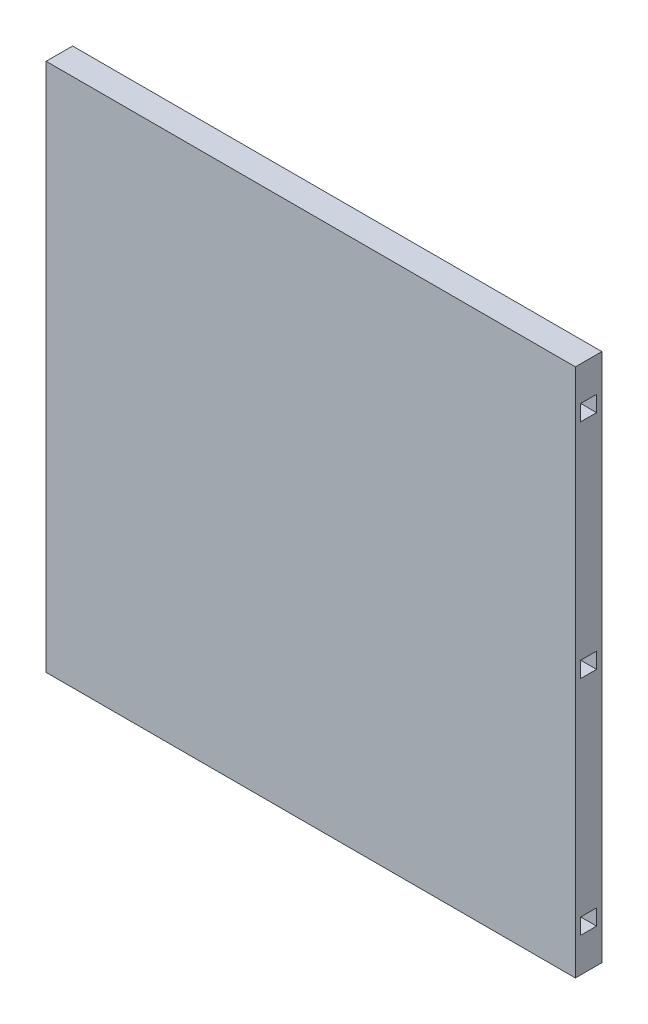
ISO-10303-21;
HEADER;
FILE_DESCRIPTION(('STEP AP214'),'2;1');
FILE_NAME('part.step','',(''),(''),'','','');
FILE_SCHEMA(('AUTOMOTIVE_DESIGN { 1 0 10303 214 1 1 1 1 }'));
ENDSEC;
DATA;
#1=APPLICATION_CONTEXT('core data for automotive mechanical design processes');
#2=APPLICATION_PROTOCOL_DEFINITION('international standard','automotive_design',2000,#1);
#3=PRODUCT_CONTEXT('',#1,'mechanical');
#4=PRODUCT('Part','Part','',(#3));
#5=PRODUCT_RELATED_PRODUCT_CATEGORY('part','',(#4));
#6=PRODUCT_DEFINITION_FORMATION('','',#4);
#7=PRODUCT_DEFINITION_CONTEXT('part definition',#1,'design');
#8=PRODUCT_DEFINITION('design','',#6,#7);
#9=PRODUCT_DEFINITION_SHAPE('','',#8);
#10=(LENGTH_UNIT() NAMED_UNIT(*) SI_UNIT(.MILLI.,.METRE.));
#11=(NAMED_UNIT(*) PLANE_ANGLE_UNIT() SI_UNIT($,.RADIAN.));
#12=(NAMED_UNIT(*) SI_UNIT($,.STERADIAN.) SOLID_ANGLE_UNIT());
#13=UNCERTAINTY_MEASURE_WITH_UNIT(LENGTH_MEASURE(1.E-05),#10,'distance_accuracy_value','');
#14=(GEOMETRIC_REPRESENTATION_CONTEXT(3) GLOBAL_UNCERTAINTY_ASSIGNED_CONTEXT((#13)) GLOBAL_UNIT_ASSIGNED_CONTEXT((#10,
#11,#12)) REPRESENTATION_CONTEXT('',''));
#15=CARTESIAN_POINT('',(0.,0.,0.));
#16=DIRECTION('',(0.,0.,1.));
#17=DIRECTION('',(1.,0.,0.));
#18=AXIS2_PLACEMENT_3D('',#15,#16,#17);
#19=CARTESIAN_POINT('',(-50.,-50.,5.));
#20=DIRECTION('',(0.,1.,0.));
#21=DIRECTION('',(0.,0.,1.));
#22=AXIS2_PLACEMENT_3D('',#19,#20,#21);
#23=PLANE('',#22);
#24=DIRECTION('',(0.,0.,1.));
#25=VECTOR('',#24,1.);
#26=CARTESIAN_POINT('',(-1.5,-50.,0.));
#27=LINE('',#26,#25);
#28=CARTESIAN_POINT('',(-1.5,-50.,1.));
#29=VERTEX_POINT('',#28);
#30=CARTESIAN_POINT('',(-1.5,-50.,4.));
#31=VERTEX_POINT('',#30);
#32=EDGE_CURVE('E63',#29,#31,#27,.T.);
#33=ORIENTED_EDGE('',*,*,#32,.T.);
#34=DIRECTION('',(-1.,0.,0.));
#35=VECTOR('',#34,1.);
#36=CARTESIAN_POINT('',(0.,-50.,4.));
#37=LINE('',#36,#35);
#38=CARTESIAN_POINT('',(1.5,-50.,4.));
#39=VERTEX_POINT('',#38);
#40=EDGE_CURVE('E282',#39,#31,#37,.T.);
#41=ORIENTED_EDGE('',*,*,#40,.F.);
#42=DIRECTION('',(0.,0.,1.));
#43=VECTOR('',#42,1.);
#44=CARTESIAN_POINT('',(1.5,-50.,0.));
#45=LINE('',#44,#43);
#46=CARTESIAN_POINT('',(1.5,-50.,1.));
#47=VERTEX_POINT('',#46);
#48=EDGE_CURVE('E301',#47,#39,#45,.T.);
#49=ORIENTED_EDGE('',*,*,#48,.F.);
#50=DIRECTION('',(-1.,0.,0.));
#51=VECTOR('',#50,1.);
#52=CARTESIAN_POINT('',(0.,-50.,1.));
#53=LINE('',#52,#51);
#54=EDGE_CURVE('E296',#47,#29,#53,.T.);
#55=ORIENTED_EDGE('',*,*,#54,.T.);
#56=EDGE_LOOP('',(#33,#41,#49,#55));
#57=FACE_BOUND('',#56,.T.);
#58=DIRECTION('',(1.,0.,0.));
#59=VECTOR('',#58,1.);
#60=CARTESIAN_POINT('',(-50.,-50.,0.));
#61=LINE('',#60,#59);
#62=CARTESIAN_POINT('',(-50.,-50.,0.));
#63=VERTEX_POINT('',#62);
#64=CARTESIAN_POINT('',(50.,-50.,0.));
#65=VERTEX_POINT('',#64);
#66=EDGE_CURVE('E496',#63,#65,#61,.T.);
#67=ORIENTED_EDGE('',*,*,#66,.T.);
#68=DIRECTION('',(0.,0.,-1.));
#69=VECTOR('',#68,1.);
#70=CARTESIAN_POINT('',(50.,-50.,5.));
#71=LINE('',#70,#69);
#72=CARTESIAN_POINT('',(50.,-50.,5.));
#73=VERTEX_POINT('',#72);
#74=EDGE_CURVE('E505',#73,#65,#71,.T.);
#75=ORIENTED_EDGE('',*,*,#74,.F.);
#76=DIRECTION('',(1.,0.,0.));
#77=VECTOR('',#76,1.);
#78=CARTESIAN_POINT('',(-50.,-50.,5.));
#79=LINE('',#78,#77);
#80=CARTESIAN_POINT('',(-50.,-50.,5.));
#81=VERTEX_POINT('',#80);
#82=EDGE_CURVE('E502',#81,#73,#79,.T.);
#83=ORIENTED_EDGE('',*,*,#82,.F.);
#84=DIRECTION('',(0.,0.,-1.));
#85=VECTOR('',#84,1.);
#86=CARTESIAN_POINT('',(-50.,-50.,5.));
#87=LINE('',#86,#85);
#88=EDGE_CURVE('E520',#81,#63,#87,.T.);
#89=ORIENTED_EDGE('',*,*,#88,.T.);
#90=EDGE_LOOP('',(#67,#75,#83,#89));
#91=FACE_BOUND('',#90,.T.);
#92=DIRECTION('',(1.,0.,0.));
#93=VECTOR('',#92,1.);
#94=CARTESIAN_POINT('',(0.,-50.,4.));
#95=LINE('',#94,#93);
#96=CARTESIAN_POINT('',(46.,-50.,4.));
#97=VERTEX_POINT('',#96);
#98=CARTESIAN_POINT('',(49.,-50.,4.));
#99=VERTEX_POINT('',#98);
#100=EDGE_CURVE('E335',#97,#99,#95,.T.);
#101=ORIENTED_EDGE('',*,*,#100,.T.);
#102=DIRECTION('',(0.,0.,-1.));
#103=VECTOR('',#102,1.);
#104=CARTESIAN_POINT('',(49.,-50.,0.));
#105=LINE('',#104,#103);
#106=CARTESIAN_POINT('',(49.,-50.,1.));
#107=VERTEX_POINT('',#106);
#108=EDGE_CURVE('E323',#99,#107,#105,.T.);
#109=ORIENTED_EDGE('',*,*,#108,.T.);
#110=DIRECTION('',(1.,0.,0.));
#111=VECTOR('',#110,1.);
#112=CARTESIAN_POINT('',(0.,-50.,1.));
#113=LINE('',#112,#111);
#114=CARTESIAN_POINT('',(46.,-50.,1.));
#115=VERTEX_POINT('',#114);
#116=EDGE_CURVE('E343',#115,#107,#113,.T.);
#117=ORIENTED_EDGE('',*,*,#116,.F.);
#118=DIRECTION('',(0.,0.,-1.));
#119=VECTOR('',#118,1.);
#120=CARTESIAN_POINT('',(46.,-50.,0.));
#121=LINE('',#120,#119);
#122=EDGE_CURVE('E339',#97,#115,#121,.T.);
#123=ORIENTED_EDGE('',*,*,#122,.F.);
#124=EDGE_LOOP('',(#101,#109,#117,#123));
#125=FACE_BOUND('',#124,.T.);
#126=DIRECTION('',(-1.,0.,0.));
#127=VECTOR('',#126,1.);
#128=CARTESIAN_POINT('',(0.,-50.,1.));
#129=LINE('',#128,#127);
#130=CARTESIAN_POINT('',(-46.,-50.,1.));
#131=VERTEX_POINT('',#130);
#132=CARTESIAN_POINT('',(-49.,-50.,1.));
#133=VERTEX_POINT('',#132);
#134=EDGE_CURVE('E55',#131,#133,#129,.T.);
#135=ORIENTED_EDGE('',*,*,#134,.T.);
#136=DIRECTION('',(0.,0.,-1.));
#137=VECTOR('',#136,1.);
#138=CARTESIAN_POINT('',(-49.,-50.,0.));
#139=LINE('',#138,#137);
#140=CARTESIAN_POINT('',(-49.,-50.,4.));
#141=VERTEX_POINT('',#140);
#142=EDGE_CURVE('E249',#141,#133,#139,.T.);
#143=ORIENTED_EDGE('',*,*,#142,.F.);
#144=DIRECTION('',(-1.,0.,0.));
#145=VECTOR('',#144,1.);
#146=CARTESIAN_POINT('',(0.,-50.,4.));
#147=LINE('',#146,#145);
#148=CARTESIAN_POINT('',(-46.,-50.,4.));
#149=VERTEX_POINT('',#148);
#150=EDGE_CURVE('E253',#149,#141,#147,.T.);
#151=ORIENTED_EDGE('',*,*,#150,.F.);
#152=DIRECTION('',(0.,0.,-1.));
#153=VECTOR('',#152,1.);
#154=CARTESIAN_POINT('',(-46.,-50.,0.));
#155=LINE('',#154,#153);
#156=EDGE_CURVE('E262',#149,#131,#155,.T.);
#157=ORIENTED_EDGE('',*,*,#156,.T.);
#158=EDGE_LOOP('',(#135,#143,#151,#157));
#159=FACE_BOUND('',#158,.T.);
#160=ADVANCED_FACE('F39',(#57,#91,#125,#159),#23,.F.);
#161=CARTESIAN_POINT('',(50.,50.,5.));
#162=DIRECTION('',(-1.,0.,0.));
#163=DIRECTION('',(0.,-1.,0.));
#164=AXIS2_PLACEMENT_3D('',#161,#162,#163);
#165=PLANE('',#164);
#166=DIRECTION('',(0.,1.,0.));
#167=VECTOR('',#166,1.);
#168=CARTESIAN_POINT('',(50.,0.,1.));
#169=LINE('',#168,#167);
#170=CARTESIAN_POINT('',(50.,40.5092729378531,1.));
#171=VERTEX_POINT('',#170);
#172=CARTESIAN_POINT('',(50.,43.5092729378531,1.));
#173=VERTEX_POINT('',#172);
#174=EDGE_CURVE('E381',#171,#173,#169,.T.);
#175=ORIENTED_EDGE('',*,*,#174,.F.);
#176=DIRECTION('',(0.,0.,-1.));
#177=VECTOR('',#176,1.);
#178=CARTESIAN_POINT('',(50.,40.5092729378531,0.));
#179=LINE('',#178,#177);
#180=CARTESIAN_POINT('',(50.,40.5092729378531,4.));
#181=VERTEX_POINT('',#180);
#182=EDGE_CURVE('E378',#181,#171,#179,.T.);
#183=ORIENTED_EDGE('',*,*,#182,.F.);
#184=DIRECTION('',(0.,1.,0.));
#185=VECTOR('',#184,1.);
#186=CARTESIAN_POINT('',(50.,0.,4.));
#187=LINE('',#186,#185);
#188=CARTESIAN_POINT('',(50.,43.5092729378531,4.));
#189=VERTEX_POINT('',#188);
#190=EDGE_CURVE('E367',#181,#189,#187,.T.);
#191=ORIENTED_EDGE('',*,*,#190,.T.);
#192=DIRECTION('',(0.,0.,-1.));
#193=VECTOR('',#192,1.);
#194=CARTESIAN_POINT('',(50.,43.5092729378531,0.));
#195=LINE('',#194,#193);
#196=EDGE_CURVE('E386',#189,#173,#195,.T.);
#197=ORIENTED_EDGE('',*,*,#196,.T.);
#198=EDGE_LOOP('',(#175,#183,#191,#197));
#199=FACE_BOUND('',#198,.T.);
#200=DIRECTION('',(0.,1.,0.));
#201=VECTOR('',#200,1.);
#202=CARTESIAN_POINT('',(50.,0.,1.));
#203=LINE('',#202,#201);
#204=CARTESIAN_POINT('',(50.,-1.49999999999999,1.));
#205=VERTEX_POINT('',#204);
#206=CARTESIAN_POINT('',(50.,1.50000000000001,1.));
#207=VERTEX_POINT('',#206);
#208=EDGE_CURVE('E425',#205,#207,#203,.T.);
#209=ORIENTED_EDGE('',*,*,#208,.F.);
#210=DIRECTION('',(0.,0.,-1.));
#211=VECTOR('',#210,1.);
#212=CARTESIAN_POINT('',(50.,-1.5,0.));
#213=LINE('',#212,#211);
#214=CARTESIAN_POINT('',(50.,-1.5,4.));
#215=VERTEX_POINT('',#214);
#216=EDGE_CURVE('E422',#215,#205,#213,.T.);
#217=ORIENTED_EDGE('',*,*,#216,.F.);
#218=DIRECTION('',(0.,1.,0.));
#219=VECTOR('',#218,1.);
#220=CARTESIAN_POINT('',(50.,0.,4.));
#221=LINE('',#220,#219);
#222=CARTESIAN_POINT('',(50.,1.50000000000001,4.));
#223=VERTEX_POINT('',#222);
#224=EDGE_CURVE('E411',#215,#223,#221,.T.);
#225=ORIENTED_EDGE('',*,*,#224,.T.);
#226=DIRECTION('',(0.,0.,-1.));
#227=VECTOR('',#226,1.);
#228=CARTESIAN_POINT('',(50.,1.50000000000001,0.));
#229=LINE('',#228,#227);
#230=EDGE_CURVE('E430',#223,#207,#229,.T.);
#231=ORIENTED_EDGE('',*,*,#230,.T.);
#232=EDGE_LOOP('',(#209,#217,#225,#231));
#233=FACE_BOUND('',#232,.T.);
#234=DIRECTION('',(0.,1.,0.));
#235=VECTOR('',#234,1.);
#236=CARTESIAN_POINT('',(50.,50.,0.));
#237=LINE('',#236,#235);
#238=CARTESIAN_POINT('',(50.,50.,0.));
#239=VERTEX_POINT('',#238);
#240=EDGE_CURVE('E396',#65,#239,#237,.T.);
#241=ORIENTED_EDGE('',*,*,#240,.T.);
#242=DIRECTION('',(0.,0.,-1.));
#243=VECTOR('',#242,1.);
#244=CARTESIAN_POINT('',(50.,50.,5.));
#245=LINE('',#244,#243);
#246=CARTESIAN_POINT('',(50.,50.,5.));
#247=VERTEX_POINT('',#246);
#248=EDGE_CURVE('E11',#247,#239,#245,.T.);
#249=ORIENTED_EDGE('',*,*,#248,.F.);
#250=DIRECTION('',(0.,1.,0.));
#251=VECTOR('',#250,1.);
#252=CARTESIAN_POINT('',(50.,50.,5.));
#253=LINE('',#252,#251);
#254=EDGE_CURVE('E491',#73,#247,#253,.T.);
#255=ORIENTED_EDGE('',*,*,#254,.F.);
#256=ORIENTED_EDGE('',*,*,#74,.T.);
#257=EDGE_LOOP('',(#241,#249,#255,#256));
#258=FACE_BOUND('',#257,.T.);
#259=DIRECTION('',(0.,0.,-1.));
#260=VECTOR('',#259,1.);
#261=CARTESIAN_POINT('',(50.,-40.5092729378531,-1.87393031360122E-13));
#262=LINE('',#261,#260);
#263=CARTESIAN_POINT('',(50.,-40.5092729378531,3.99999999999989));
#264=VERTEX_POINT('',#263);
#265=CARTESIAN_POINT('',(50.,-40.5092729378531,0.999999999999888));
#266=VERTEX_POINT('',#265);
#267=EDGE_CURVE('E272',#264,#266,#262,.T.);
#268=ORIENTED_EDGE('',*,*,#267,.T.);
#269=DIRECTION('',(0.,-1.,0.));
#270=VECTOR('',#269,1.);
#271=CARTESIAN_POINT('',(50.,0.,0.999999999999999));
#272=LINE('',#271,#270);
#273=CARTESIAN_POINT('',(50.,-43.5092729378531,0.999999999999879));
#274=VERTEX_POINT('',#273);
#275=EDGE_CURVE('E453',#266,#274,#272,.T.);
#276=ORIENTED_EDGE('',*,*,#275,.T.);
#277=DIRECTION('',(0.,0.,-1.));
#278=VECTOR('',#277,1.);
#279=CARTESIAN_POINT('',(50.,-43.5092729378531,-2.01270819167936E-13));
#280=LINE('',#279,#278);
#281=CARTESIAN_POINT('',(50.,-43.5092729378531,3.99999999999988));
#282=VERTEX_POINT('',#281);
#283=EDGE_CURVE('E472',#282,#274,#280,.T.);
#284=ORIENTED_EDGE('',*,*,#283,.F.);
#285=DIRECTION('',(0.,-1.,0.));
#286=VECTOR('',#285,1.);
#287=CARTESIAN_POINT('',(50.,0.,4.));
#288=LINE('',#287,#286);
#289=EDGE_CURVE('E468',#264,#282,#288,.T.);
#290=ORIENTED_EDGE('',*,*,#289,.F.);
#291=EDGE_LOOP('',(#268,#276,#284,#290));
#292=FACE_BOUND('',#291,.T.);
#293=ADVANCED_FACE('F41',(#199,#233,#258,#292),#165,.F.);
#294=CARTESIAN_POINT('',(-50.,50.,5.));
#295=DIRECTION('',(0.,-1.,0.));
#296=DIRECTION('',(0.,0.,-1.));
#297=AXIS2_PLACEMENT_3D('',#294,#295,#296);
#298=PLANE('',#297);
#299=DIRECTION('',(-1.,0.,0.));
#300=VECTOR('',#299,1.);
#301=CARTESIAN_POINT('',(-50.,50.,0.));
#302=LINE('',#301,#300);
#303=CARTESIAN_POINT('',(-50.,50.,0.));
#304=VERTEX_POINT('',#303);
#305=EDGE_CURVE('E509',#239,#304,#302,.T.);
#306=ORIENTED_EDGE('',*,*,#305,.T.);
#307=DIRECTION('',(0.,0.,-1.));
#308=VECTOR('',#307,1.);
#309=CARTESIAN_POINT('',(-50.,50.,5.));
#310=LINE('',#309,#308);
#311=CARTESIAN_POINT('',(-50.,50.,5.));
#312=VERTEX_POINT('',#311);
#313=EDGE_CURVE('E48',#312,#304,#310,.T.);
#314=ORIENTED_EDGE('',*,*,#313,.F.);
#315=DIRECTION('',(-1.,0.,0.));
#316=VECTOR('',#315,1.);
#317=CARTESIAN_POINT('',(-50.,50.,5.));
#318=LINE('',#317,#316);
#319=EDGE_CURVE('E495',#247,#312,#318,.T.);
#320=ORIENTED_EDGE('',*,*,#319,.F.);
#321=ORIENTED_EDGE('',*,*,#248,.T.);
#322=EDGE_LOOP('',(#306,#314,#320,#321));
#323=FACE_BOUND('',#322,.T.);
#324=ADVANCED_FACE('F546',(#323),#298,.F.);
#325=CARTESIAN_POINT('',(-50.,50.,5.));
#326=DIRECTION('',(1.,0.,0.));
#327=DIRECTION('',(0.,1.,0.));
#328=AXIS2_PLACEMENT_3D('',#325,#326,#327);
#329=PLANE('',#328);
#330=DIRECTION('',(0.,-1.,0.));
#331=VECTOR('',#330,1.);
#332=CARTESIAN_POINT('',(-50.,50.,0.));
#333=LINE('',#332,#331);
#334=EDGE_CURVE('E512',#304,#63,#333,.T.);
#335=ORIENTED_EDGE('',*,*,#334,.T.);
#336=ORIENTED_EDGE('',*,*,#88,.F.);
#337=DIRECTION('',(0.,-1.,0.));
#338=VECTOR('',#337,1.);
#339=CARTESIAN_POINT('',(-50.,50.,5.));
#340=LINE('',#339,#338);
#341=EDGE_CURVE('E499',#312,#81,#340,.T.);
#342=ORIENTED_EDGE('',*,*,#341,.F.);
#343=ORIENTED_EDGE('',*,*,#313,.T.);
#344=EDGE_LOOP('',(#335,#336,#342,#343));
#345=FACE_BOUND('',#344,.T.);
#346=ADVANCED_FACE('F529',(#345),#329,.F.);
#347=CARTESIAN_POINT('',(0.,0.,5.));
#348=DIRECTION('',(0.,0.,1.));
#349=DIRECTION('',(1.,0.,0.));
#350=AXIS2_PLACEMENT_3D('',#347,#348,#349);
#351=PLANE('',#350);
#352=ORIENTED_EDGE('',*,*,#254,.T.);
#353=ORIENTED_EDGE('',*,*,#319,.T.);
#354=ORIENTED_EDGE('',*,*,#341,.T.);
#355=ORIENTED_EDGE('',*,*,#82,.T.);
#356=EDGE_LOOP('',(#352,#353,#354,#355));
#357=FACE_BOUND('',#356,.T.);
#358=ADVANCED_FACE('F545',(#357),#351,.T.);
#359=CARTESIAN_POINT('',(0.,0.,0.));
#360=DIRECTION('',(0.,0.,1.));
#361=DIRECTION('',(1.,0.,0.));
#362=AXIS2_PLACEMENT_3D('',#359,#360,#361);
#363=PLANE('',#362);
#364=ORIENTED_EDGE('',*,*,#240,.F.);
#365=ORIENTED_EDGE('',*,*,#66,.F.);
#366=ORIENTED_EDGE('',*,*,#334,.F.);
#367=ORIENTED_EDGE('',*,*,#305,.F.);
#368=EDGE_LOOP('',(#364,#365,#366,#367));
#369=FACE_BOUND('',#368,.T.);
#370=ADVANCED_FACE('F535',(#369),#363,.F.);
#371=CARTESIAN_POINT('',(45.,-40.5092729378531,-1.87393031360122E-13));
#372=DIRECTION('',(0.,-1.,0.));
#373=DIRECTION('',(0.,0.,-1.));
#374=AXIS2_PLACEMENT_3D('',#371,#372,#373);
#375=PLANE('',#374);
#376=ORIENTED_EDGE('',*,*,#267,.F.);
#377=DIRECTION('',(1.,0.,0.));
#378=VECTOR('',#377,1.);
#379=CARTESIAN_POINT('',(45.,-40.5092729378531,3.99999999999989));
#380=LINE('',#379,#378);
#381=CARTESIAN_POINT('',(45.,-40.5092729378531,3.99999999999989));
#382=VERTEX_POINT('',#381);
#383=EDGE_CURVE('E464',#382,#264,#380,.T.);
#384=ORIENTED_EDGE('',*,*,#383,.F.);
#385=DIRECTION('',(0.,0.,-1.));
#386=VECTOR('',#385,1.);
#387=CARTESIAN_POINT('',(45.,-40.5092729378531,-1.87393031360122E-13));
#388=LINE('',#387,#386);
#389=CARTESIAN_POINT('',(45.,-40.5092729378531,0.999999999999888));
#390=VERTEX_POINT('',#389);
#391=EDGE_CURVE('E448',#382,#390,#388,.T.);
#392=ORIENTED_EDGE('',*,*,#391,.T.);
#393=DIRECTION('',(1.,0.,0.));
#394=VECTOR('',#393,1.);
#395=CARTESIAN_POINT('',(45.,-40.5092729378531,0.999999999999888));
#396=LINE('',#395,#394);
#397=EDGE_CURVE('E426',#390,#266,#396,.T.);
#398=ORIENTED_EDGE('',*,*,#397,.T.);
#399=EDGE_LOOP('',(#376,#384,#392,#398));
#400=FACE_BOUND('',#399,.T.);
#401=ADVANCED_FACE('F562',(#400),#375,.T.);
#402=CARTESIAN_POINT('',(45.,0.,0.999999999999999));
#403=DIRECTION('',(0.,0.,1.));
#404=DIRECTION('',(0.,-1.,0.));
#405=AXIS2_PLACEMENT_3D('',#402,#403,#404);
#406=PLANE('',#405);
#407=ORIENTED_EDGE('',*,*,#275,.F.);
#408=ORIENTED_EDGE('',*,*,#397,.F.);
#409=DIRECTION('',(0.,-1.,0.));
#410=VECTOR('',#409,1.);
#411=CARTESIAN_POINT('',(45.,0.,0.999999999999999));
#412=LINE('',#411,#410);
#413=CARTESIAN_POINT('',(45.,-43.5092729378531,0.999999999999879));
#414=VERTEX_POINT('',#413);
#415=EDGE_CURVE('E461',#390,#414,#412,.T.);
#416=ORIENTED_EDGE('',*,*,#415,.T.);
#417=DIRECTION('',(1.,0.,0.));
#418=VECTOR('',#417,1.);
#419=CARTESIAN_POINT('',(45.,-43.5092729378531,0.999999999999879));
#420=LINE('',#419,#418);
#421=EDGE_CURVE('E482',#414,#274,#420,.T.);
#422=ORIENTED_EDGE('',*,*,#421,.T.);
#423=EDGE_LOOP('',(#407,#408,#416,#422));
#424=FACE_BOUND('',#423,.T.);
#425=ADVANCED_FACE('F567',(#424),#406,.T.);
#426=CARTESIAN_POINT('',(45.,-43.5092729378531,-2.01270819167936E-13));
#427=DIRECTION('',(0.,-1.,0.));
#428=DIRECTION('',(0.,0.,-1.));
#429=AXIS2_PLACEMENT_3D('',#426,#427,#428);
#430=PLANE('',#429);
#431=ORIENTED_EDGE('',*,*,#283,.T.);
#432=ORIENTED_EDGE('',*,*,#421,.F.);
#433=DIRECTION('',(0.,0.,-1.));
#434=VECTOR('',#433,1.);
#435=CARTESIAN_POINT('',(45.,-43.5092729378531,-2.01270819167936E-13));
#436=LINE('',#435,#434);
#437=CARTESIAN_POINT('',(45.,-43.5092729378531,3.99999999999988));
#438=VERTEX_POINT('',#437);
#439=EDGE_CURVE('E457',#438,#414,#436,.T.);
#440=ORIENTED_EDGE('',*,*,#439,.F.);
#441=DIRECTION('',(1.,0.,0.));
#442=VECTOR('',#441,1.);
#443=CARTESIAN_POINT('',(45.,-43.5092729378531,3.99999999999988));
#444=LINE('',#443,#442);
#445=EDGE_CURVE('E485',#438,#282,#444,.T.);
#446=ORIENTED_EDGE('',*,*,#445,.T.);
#447=EDGE_LOOP('',(#431,#432,#440,#446));
#448=FACE_BOUND('',#447,.T.);
#449=ADVANCED_FACE('F573',(#448),#430,.F.);
#450=CARTESIAN_POINT('',(45.,0.,4.));
#451=DIRECTION('',(0.,0.,1.));
#452=DIRECTION('',(0.,-1.,0.));
#453=AXIS2_PLACEMENT_3D('',#450,#451,#452);
#454=PLANE('',#453);
#455=ORIENTED_EDGE('',*,*,#289,.T.);
#456=ORIENTED_EDGE('',*,*,#445,.F.);
#457=DIRECTION('',(0.,-1.,0.));
#458=VECTOR('',#457,1.);
#459=CARTESIAN_POINT('',(45.,0.,4.));
#460=LINE('',#459,#458);
#461=EDGE_CURVE('E452',#382,#438,#460,.T.);
#462=ORIENTED_EDGE('',*,*,#461,.F.);
#463=ORIENTED_EDGE('',*,*,#383,.T.);
#464=EDGE_LOOP('',(#455,#456,#462,#463));
#465=FACE_BOUND('',#464,.T.);
#466=ADVANCED_FACE('F569',(#465),#454,.F.);
#467=CARTESIAN_POINT('',(45.,0.,0.));
#468=DIRECTION('',(1.,0.,0.));
#469=DIRECTION('',(0.,1.,0.));
#470=AXIS2_PLACEMENT_3D('',#467,#468,#469);
#471=PLANE('',#470);
#472=ORIENTED_EDGE('',*,*,#391,.F.);
#473=ORIENTED_EDGE('',*,*,#461,.T.);
#474=ORIENTED_EDGE('',*,*,#439,.T.);
#475=ORIENTED_EDGE('',*,*,#415,.F.);
#476=EDGE_LOOP('',(#472,#473,#474,#475));
#477=FACE_BOUND('',#476,.T.);
#478=ADVANCED_FACE('F572',(#477),#471,.T.);
#479=CARTESIAN_POINT('',(45.,-1.5,0.));
#480=DIRECTION('',(0.,-1.,0.));
#481=DIRECTION('',(1.,0.,0.));
#482=AXIS2_PLACEMENT_3D('',#479,#480,#481);
#483=PLANE('',#482);
#484=ORIENTED_EDGE('',*,*,#216,.T.);
#485=DIRECTION('',(1.,0.,0.));
#486=VECTOR('',#485,1.);
#487=CARTESIAN_POINT('',(45.,-1.5,1.));
#488=LINE('',#487,#486);
#489=CARTESIAN_POINT('',(45.,-1.5,1.));
#490=VERTEX_POINT('',#489);
#491=EDGE_CURVE('E421',#490,#205,#488,.T.);
#492=ORIENTED_EDGE('',*,*,#491,.F.);
#493=DIRECTION('',(0.,0.,-1.));
#494=VECTOR('',#493,1.);
#495=CARTESIAN_POINT('',(45.,-1.5,0.));
#496=LINE('',#495,#494);
#497=CARTESIAN_POINT('',(45.,-1.5,4.));
#498=VERTEX_POINT('',#497);
#499=EDGE_CURVE('E406',#498,#490,#496,.T.);
#500=ORIENTED_EDGE('',*,*,#499,.F.);
#501=DIRECTION('',(1.,0.,0.));
#502=VECTOR('',#501,1.);
#503=CARTESIAN_POINT('',(45.,-1.5,4.));
#504=LINE('',#503,#502);
#505=EDGE_CURVE('E382',#498,#215,#504,.T.);
#506=ORIENTED_EDGE('',*,*,#505,.T.);
#507=EDGE_LOOP('',(#484,#492,#500,#506));
#508=FACE_BOUND('',#507,.T.);
#509=ADVANCED_FACE('F583',(#508),#483,.F.);
#510=CARTESIAN_POINT('',(45.,0.,4.));
#511=DIRECTION('',(0.,0.,-1.));
#512=DIRECTION('',(-1.,0.,0.));
#513=AXIS2_PLACEMENT_3D('',#510,#511,#512);
#514=PLANE('',#513);
#515=ORIENTED_EDGE('',*,*,#224,.F.);
#516=ORIENTED_EDGE('',*,*,#505,.F.);
#517=DIRECTION('',(0.,1.,0.));
#518=VECTOR('',#517,1.);
#519=CARTESIAN_POINT('',(45.,0.,4.));
#520=LINE('',#519,#518);
#521=CARTESIAN_POINT('',(45.,1.50000000000001,4.));
#522=VERTEX_POINT('',#521);
#523=EDGE_CURVE('E418',#498,#522,#520,.T.);
#524=ORIENTED_EDGE('',*,*,#523,.T.);
#525=DIRECTION('',(1.,0.,0.));
#526=VECTOR('',#525,1.);
#527=CARTESIAN_POINT('',(45.,1.50000000000001,4.));
#528=LINE('',#527,#526);
#529=EDGE_CURVE('E439',#522,#223,#528,.T.);
#530=ORIENTED_EDGE('',*,*,#529,.T.);
#531=EDGE_LOOP('',(#515,#516,#524,#530));
#532=FACE_BOUND('',#531,.T.);
#533=ADVANCED_FACE('F587',(#532),#514,.T.);
#534=CARTESIAN_POINT('',(45.,1.50000000000001,0.));
#535=DIRECTION('',(0.,-1.,0.));
#536=DIRECTION('',(1.,0.,0.));
#537=AXIS2_PLACEMENT_3D('',#534,#535,#536);
#538=PLANE('',#537);
#539=ORIENTED_EDGE('',*,*,#230,.F.);
#540=ORIENTED_EDGE('',*,*,#529,.F.);
#541=DIRECTION('',(0.,0.,-1.));
#542=VECTOR('',#541,1.);
#543=CARTESIAN_POINT('',(45.,1.50000000000001,0.));
#544=LINE('',#543,#542);
#545=CARTESIAN_POINT('',(45.,1.50000000000001,1.));
#546=VERTEX_POINT('',#545);
#547=EDGE_CURVE('E415',#522,#546,#544,.T.);
#548=ORIENTED_EDGE('',*,*,#547,.T.);
#549=DIRECTION('',(1.,0.,0.));
#550=VECTOR('',#549,1.);
#551=CARTESIAN_POINT('',(45.,1.50000000000001,1.));
#552=LINE('',#551,#550);
#553=EDGE_CURVE('E442',#546,#207,#552,.T.);
#554=ORIENTED_EDGE('',*,*,#553,.T.);
#555=EDGE_LOOP('',(#539,#540,#548,#554));
#556=FACE_BOUND('',#555,.T.);
#557=ADVANCED_FACE('F593',(#556),#538,.T.);
#558=CARTESIAN_POINT('',(45.,0.,1.));
#559=DIRECTION('',(0.,0.,-1.));
#560=DIRECTION('',(-1.,0.,0.));
#561=AXIS2_PLACEMENT_3D('',#558,#559,#560);
#562=PLANE('',#561);
#563=ORIENTED_EDGE('',*,*,#208,.T.);
#564=ORIENTED_EDGE('',*,*,#553,.F.);
#565=DIRECTION('',(0.,1.,0.));
#566=VECTOR('',#565,1.);
#567=CARTESIAN_POINT('',(45.,0.,1.));
#568=LINE('',#567,#566);
#569=EDGE_CURVE('E410',#490,#546,#568,.T.);
#570=ORIENTED_EDGE('',*,*,#569,.F.);
#571=ORIENTED_EDGE('',*,*,#491,.T.);
#572=EDGE_LOOP('',(#563,#564,#570,#571));
#573=FACE_BOUND('',#572,.T.);
#574=ADVANCED_FACE('F589',(#573),#562,.F.);
#575=CARTESIAN_POINT('',(45.,0.,0.));
#576=DIRECTION('',(1.,0.,0.));
#577=DIRECTION('',(0.,1.,0.));
#578=AXIS2_PLACEMENT_3D('',#575,#576,#577);
#579=PLANE('',#578);
#580=ORIENTED_EDGE('',*,*,#499,.T.);
#581=ORIENTED_EDGE('',*,*,#569,.T.);
#582=ORIENTED_EDGE('',*,*,#547,.F.);
#583=ORIENTED_EDGE('',*,*,#523,.F.);
#584=EDGE_LOOP('',(#580,#581,#582,#583));
#585=FACE_BOUND('',#584,.T.);
#586=ADVANCED_FACE('F592',(#585),#579,.T.);
#587=CARTESIAN_POINT('',(45.,40.5092729378531,0.));
#588=DIRECTION('',(0.,-1.,0.));
#589=DIRECTION('',(1.,0.,0.));
#590=AXIS2_PLACEMENT_3D('',#587,#588,#589);
#591=PLANE('',#590);
#592=ORIENTED_EDGE('',*,*,#182,.T.);
#593=DIRECTION('',(1.,0.,0.));
#594=VECTOR('',#593,1.);
#595=CARTESIAN_POINT('',(45.,40.5092729378531,1.));
#596=LINE('',#595,#594);
#597=CARTESIAN_POINT('',(45.,40.5092729378531,1.));
#598=VERTEX_POINT('',#597);
#599=EDGE_CURVE('E377',#598,#171,#596,.T.);
#600=ORIENTED_EDGE('',*,*,#599,.F.);
#601=DIRECTION('',(0.,0.,-1.));
#602=VECTOR('',#601,1.);
#603=CARTESIAN_POINT('',(45.,40.5092729378531,0.));
#604=LINE('',#603,#602);
#605=CARTESIAN_POINT('',(45.,40.5092729378531,4.));
#606=VERTEX_POINT('',#605);
#607=EDGE_CURVE('E362',#606,#598,#604,.T.);
#608=ORIENTED_EDGE('',*,*,#607,.F.);
#609=DIRECTION('',(1.,0.,0.));
#610=VECTOR('',#609,1.);
#611=CARTESIAN_POINT('',(45.,40.5092729378531,4.));
#612=LINE('',#611,#610);
#613=EDGE_CURVE('E393',#606,#181,#612,.T.);
#614=ORIENTED_EDGE('',*,*,#613,.T.);
#615=EDGE_LOOP('',(#592,#600,#608,#614));
#616=FACE_BOUND('',#615,.T.);
#617=ADVANCED_FACE('F603',(#616),#591,.F.);
#618=CARTESIAN_POINT('',(45.,0.,4.));
#619=DIRECTION('',(0.,0.,-1.));
#620=DIRECTION('',(-1.,0.,0.));
#621=AXIS2_PLACEMENT_3D('',#618,#619,#620);
#622=PLANE('',#621);
#623=ORIENTED_EDGE('',*,*,#190,.F.);
#624=ORIENTED_EDGE('',*,*,#613,.F.);
#625=DIRECTION('',(0.,1.,0.));
#626=VECTOR('',#625,1.);
#627=CARTESIAN_POINT('',(45.,0.,4.));
#628=LINE('',#627,#626);
#629=CARTESIAN_POINT('',(45.,43.5092729378531,4.));
#630=VERTEX_POINT('',#629);
#631=EDGE_CURVE('E374',#606,#630,#628,.T.);
#632=ORIENTED_EDGE('',*,*,#631,.T.);
#633=DIRECTION('',(1.,0.,0.));
#634=VECTOR('',#633,1.);
#635=CARTESIAN_POINT('',(45.,43.5092729378531,4.));
#636=LINE('',#635,#634);
#637=EDGE_CURVE('E397',#630,#189,#636,.T.);
#638=ORIENTED_EDGE('',*,*,#637,.T.);
#639=EDGE_LOOP('',(#623,#624,#632,#638));
#640=FACE_BOUND('',#639,.T.);
#641=ADVANCED_FACE('F607',(#640),#622,.T.);
#642=CARTESIAN_POINT('',(45.,43.5092729378531,0.));
#643=DIRECTION('',(0.,-1.,0.));
#644=DIRECTION('',(1.,0.,0.));
#645=AXIS2_PLACEMENT_3D('',#642,#643,#644);
#646=PLANE('',#645);
#647=ORIENTED_EDGE('',*,*,#196,.F.);
#648=ORIENTED_EDGE('',*,*,#637,.F.);
#649=DIRECTION('',(0.,0.,-1.));
#650=VECTOR('',#649,1.);
#651=CARTESIAN_POINT('',(45.,43.5092729378531,0.));
#652=LINE('',#651,#650);
#653=CARTESIAN_POINT('',(45.,43.5092729378531,1.));
#654=VERTEX_POINT('',#653);
#655=EDGE_CURVE('E371',#630,#654,#652,.T.);
#656=ORIENTED_EDGE('',*,*,#655,.T.);
#657=DIRECTION('',(1.,0.,0.));
#658=VECTOR('',#657,1.);
#659=CARTESIAN_POINT('',(45.,43.5092729378531,1.));
#660=LINE('',#659,#658);
#661=EDGE_CURVE('E400',#654,#173,#660,.T.);
#662=ORIENTED_EDGE('',*,*,#661,.T.);
#663=EDGE_LOOP('',(#647,#648,#656,#662));
#664=FACE_BOUND('',#663,.T.);
#665=ADVANCED_FACE('F613',(#664),#646,.T.);
#666=CARTESIAN_POINT('',(45.,0.,1.));
#667=DIRECTION('',(0.,0.,-1.));
#668=DIRECTION('',(-1.,0.,0.));
#669=AXIS2_PLACEMENT_3D('',#666,#667,#668);
#670=PLANE('',#669);
#671=ORIENTED_EDGE('',*,*,#174,.T.);
#672=ORIENTED_EDGE('',*,*,#661,.F.);
#673=DIRECTION('',(0.,1.,0.));
#674=VECTOR('',#673,1.);
#675=CARTESIAN_POINT('',(45.,0.,1.));
#676=LINE('',#675,#674);
#677=EDGE_CURVE('E366',#598,#654,#676,.T.);
#678=ORIENTED_EDGE('',*,*,#677,.F.);
#679=ORIENTED_EDGE('',*,*,#599,.T.);
#680=EDGE_LOOP('',(#671,#672,#678,#679));
#681=FACE_BOUND('',#680,.T.);
#682=ADVANCED_FACE('F609',(#681),#670,.F.);
#683=CARTESIAN_POINT('',(45.,0.,0.));
#684=DIRECTION('',(1.,0.,0.));
#685=DIRECTION('',(0.,1.,0.));
#686=AXIS2_PLACEMENT_3D('',#683,#684,#685);
#687=PLANE('',#686);
#688=ORIENTED_EDGE('',*,*,#607,.T.);
#689=ORIENTED_EDGE('',*,*,#677,.T.);
#690=ORIENTED_EDGE('',*,*,#655,.F.);
#691=ORIENTED_EDGE('',*,*,#631,.F.);
#692=EDGE_LOOP('',(#688,#689,#690,#691));
#693=FACE_BOUND('',#692,.T.);
#694=ADVANCED_FACE('F612',(#693),#687,.T.);
#695=CARTESIAN_POINT('',(0.,-45.,4.));
#696=DIRECTION('',(0.,0.,-1.));
#697=DIRECTION('',(-1.,0.,0.));
#698=AXIS2_PLACEMENT_3D('',#695,#696,#697);
#699=PLANE('',#698);
#700=ORIENTED_EDGE('',*,*,#100,.F.);
#701=DIRECTION('',(0.,-1.,0.));
#702=VECTOR('',#701,1.);
#703=CARTESIAN_POINT('',(46.,-45.,4.));
#704=LINE('',#703,#702);
#705=CARTESIAN_POINT('',(46.,-45.,4.));
#706=VERTEX_POINT('',#705);
#707=EDGE_CURVE('E334',#706,#97,#704,.T.);
#708=ORIENTED_EDGE('',*,*,#707,.F.);
#709=DIRECTION('',(1.,0.,0.));
#710=VECTOR('',#709,1.);
#711=CARTESIAN_POINT('',(0.,-45.,4.));
#712=LINE('',#711,#710);
#713=CARTESIAN_POINT('',(49.,-45.,4.));
#714=VERTEX_POINT('',#713);
#715=EDGE_CURVE('E318',#706,#714,#712,.T.);
#716=ORIENTED_EDGE('',*,*,#715,.T.);
#717=DIRECTION('',(0.,-1.,0.));
#718=VECTOR('',#717,1.);
#719=CARTESIAN_POINT('',(49.,-45.,4.));
#720=LINE('',#719,#718);
#721=EDGE_CURVE('E297',#714,#99,#720,.T.);
#722=ORIENTED_EDGE('',*,*,#721,.T.);
#723=EDGE_LOOP('',(#700,#708,#716,#722));
#724=FACE_BOUND('',#723,.T.);
#725=ADVANCED_FACE('F623',(#724),#699,.T.);
#726=CARTESIAN_POINT('',(49.,-45.,0.));
#727=DIRECTION('',(-1.,0.,0.));
#728=DIRECTION('',(0.,0.,1.));
#729=AXIS2_PLACEMENT_3D('',#726,#727,#728);
#730=PLANE('',#729);
#731=ORIENTED_EDGE('',*,*,#108,.F.);
#732=ORIENTED_EDGE('',*,*,#721,.F.);
#733=DIRECTION('',(0.,0.,-1.));
#734=VECTOR('',#733,1.);
#735=CARTESIAN_POINT('',(49.,-45.,0.));
#736=LINE('',#735,#734);
#737=CARTESIAN_POINT('',(49.,-45.,1.));
#738=VERTEX_POINT('',#737);
#739=EDGE_CURVE('E331',#714,#738,#736,.T.);
#740=ORIENTED_EDGE('',*,*,#739,.T.);
#741=DIRECTION('',(0.,-1.,0.));
#742=VECTOR('',#741,1.);
#743=CARTESIAN_POINT('',(49.,-45.,1.));
#744=LINE('',#743,#742);
#745=EDGE_CURVE('E353',#738,#107,#744,.T.);
#746=ORIENTED_EDGE('',*,*,#745,.T.);
#747=EDGE_LOOP('',(#731,#732,#740,#746));
#748=FACE_BOUND('',#747,.T.);
#749=ADVANCED_FACE('F627',(#748),#730,.T.);
#750=CARTESIAN_POINT('',(0.,-45.,1.));
#751=DIRECTION('',(0.,0.,-1.));
#752=DIRECTION('',(-1.,0.,0.));
#753=AXIS2_PLACEMENT_3D('',#750,#751,#752);
#754=PLANE('',#753);
#755=ORIENTED_EDGE('',*,*,#116,.T.);
#756=ORIENTED_EDGE('',*,*,#745,.F.);
#757=DIRECTION('',(1.,0.,0.));
#758=VECTOR('',#757,1.);
#759=CARTESIAN_POINT('',(0.,-45.,1.));
#760=LINE('',#759,#758);
#761=CARTESIAN_POINT('',(46.,-45.,1.));
#762=VERTEX_POINT('',#761);
#763=EDGE_CURVE('E327',#762,#738,#760,.T.);
#764=ORIENTED_EDGE('',*,*,#763,.F.);
#765=DIRECTION('',(0.,-1.,0.));
#766=VECTOR('',#765,1.);
#767=CARTESIAN_POINT('',(46.,-45.,1.));
#768=LINE('',#767,#766);
#769=EDGE_CURVE('E356',#762,#115,#768,.T.);
#770=ORIENTED_EDGE('',*,*,#769,.T.);
#771=EDGE_LOOP('',(#755,#756,#764,#770));
#772=FACE_BOUND('',#771,.T.);
#773=ADVANCED_FACE('F633',(#772),#754,.F.);
#774=CARTESIAN_POINT('',(46.,-45.,0.));
#775=DIRECTION('',(-1.,0.,0.));
#776=DIRECTION('',(0.,0.,1.));
#777=AXIS2_PLACEMENT_3D('',#774,#775,#776);
#778=PLANE('',#777);
#779=ORIENTED_EDGE('',*,*,#122,.T.);
#780=ORIENTED_EDGE('',*,*,#769,.F.);
#781=DIRECTION('',(0.,0.,-1.));
#782=VECTOR('',#781,1.);
#783=CARTESIAN_POINT('',(46.,-45.,0.));
#784=LINE('',#783,#782);
#785=EDGE_CURVE('E322',#706,#762,#784,.T.);
#786=ORIENTED_EDGE('',*,*,#785,.F.);
#787=ORIENTED_EDGE('',*,*,#707,.T.);
#788=EDGE_LOOP('',(#779,#780,#786,#787));
#789=FACE_BOUND('',#788,.T.);
#790=ADVANCED_FACE('F629',(#789),#778,.F.);
#791=CARTESIAN_POINT('',(0.,-45.,0.));
#792=DIRECTION('',(0.,-1.,0.));
#793=DIRECTION('',(0.,0.,-1.));
#794=AXIS2_PLACEMENT_3D('',#791,#792,#793);
#795=PLANE('',#794);
#796=ORIENTED_EDGE('',*,*,#715,.F.);
#797=ORIENTED_EDGE('',*,*,#785,.T.);
#798=ORIENTED_EDGE('',*,*,#763,.T.);
#799=ORIENTED_EDGE('',*,*,#739,.F.);
#800=EDGE_LOOP('',(#796,#797,#798,#799));
#801=FACE_BOUND('',#800,.T.);
#802=ADVANCED_FACE('F632',(#801),#795,.T.);
#803=CARTESIAN_POINT('',(-1.5,-45.,0.));
#804=DIRECTION('',(1.,0.,0.));
#805=DIRECTION('',(0.,0.,-1.));
#806=AXIS2_PLACEMENT_3D('',#803,#804,#805);
#807=PLANE('',#806);
#808=ORIENTED_EDGE('',*,*,#32,.F.);
#809=DIRECTION('',(0.,-1.,0.));
#810=VECTOR('',#809,1.);
#811=CARTESIAN_POINT('',(-1.5,-45.,1.));
#812=LINE('',#811,#810);
#813=CARTESIAN_POINT('',(-1.5,-45.,1.));
#814=VERTEX_POINT('',#813);
#815=EDGE_CURVE('E293',#814,#29,#812,.T.);
#816=ORIENTED_EDGE('',*,*,#815,.F.);
#817=DIRECTION('',(0.,0.,1.));
#818=VECTOR('',#817,1.);
#819=CARTESIAN_POINT('',(-1.5,-45.,0.));
#820=LINE('',#819,#818);
#821=CARTESIAN_POINT('',(-1.5,-45.,4.));
#822=VERTEX_POINT('',#821);
#823=EDGE_CURVE('E278',#814,#822,#820,.T.);
#824=ORIENTED_EDGE('',*,*,#823,.T.);
#825=DIRECTION('',(0.,-1.,0.));
#826=VECTOR('',#825,1.);
#827=CARTESIAN_POINT('',(-1.5,-45.,4.));
#828=LINE('',#827,#826);
#829=EDGE_CURVE('E263',#822,#31,#828,.T.);
#830=ORIENTED_EDGE('',*,*,#829,.T.);
#831=EDGE_LOOP('',(#808,#816,#824,#830));
#832=FACE_BOUND('',#831,.T.);
#833=ADVANCED_FACE('F643',(#832),#807,.T.);
#834=CARTESIAN_POINT('',(0.,-45.,4.));
#835=DIRECTION('',(0.,0.,1.));
#836=DIRECTION('',(1.,0.,0.));
#837=AXIS2_PLACEMENT_3D('',#834,#835,#836);
#838=PLANE('',#837);
#839=ORIENTED_EDGE('',*,*,#40,.T.);
#840=ORIENTED_EDGE('',*,*,#829,.F.);
#841=DIRECTION('',(-1.,0.,0.));
#842=VECTOR('',#841,1.);
#843=CARTESIAN_POINT('',(0.,-45.,4.));
#844=LINE('',#843,#842);
#845=CARTESIAN_POINT('',(1.5,-45.,4.));
#846=VERTEX_POINT('',#845);
#847=EDGE_CURVE('E289',#846,#822,#844,.T.);
#848=ORIENTED_EDGE('',*,*,#847,.F.);
#849=DIRECTION('',(0.,-1.,0.));
#850=VECTOR('',#849,1.);
#851=CARTESIAN_POINT('',(1.5,-45.,4.));
#852=LINE('',#851,#850);
#853=EDGE_CURVE('E310',#846,#39,#852,.T.);
#854=ORIENTED_EDGE('',*,*,#853,.T.);
#855=EDGE_LOOP('',(#839,#840,#848,#854));
#856=FACE_BOUND('',#855,.T.);
#857=ADVANCED_FACE('F647',(#856),#838,.F.);
#858=CARTESIAN_POINT('',(1.5,-45.,0.));
#859=DIRECTION('',(1.,0.,0.));
#860=DIRECTION('',(0.,0.,-1.));
#861=AXIS2_PLACEMENT_3D('',#858,#859,#860);
#862=PLANE('',#861);
#863=ORIENTED_EDGE('',*,*,#48,.T.);
#864=ORIENTED_EDGE('',*,*,#853,.F.);
#865=DIRECTION('',(0.,0.,1.));
#866=VECTOR('',#865,1.);
#867=CARTESIAN_POINT('',(1.5,-45.,0.));
#868=LINE('',#867,#866);
#869=CARTESIAN_POINT('',(1.5,-45.,1.));
#870=VERTEX_POINT('',#869);
#871=EDGE_CURVE('E285',#870,#846,#868,.T.);
#872=ORIENTED_EDGE('',*,*,#871,.F.);
#873=DIRECTION('',(0.,-1.,0.));
#874=VECTOR('',#873,1.);
#875=CARTESIAN_POINT('',(1.5,-45.,1.));
#876=LINE('',#875,#874);
#877=EDGE_CURVE('E313',#870,#47,#876,.T.);
#878=ORIENTED_EDGE('',*,*,#877,.T.);
#879=EDGE_LOOP('',(#863,#864,#872,#878));
#880=FACE_BOUND('',#879,.T.);
#881=ADVANCED_FACE('F652',(#880),#862,.F.);
#882=CARTESIAN_POINT('',(0.,-45.,1.));
#883=DIRECTION('',(0.,0.,1.));
#884=DIRECTION('',(1.,0.,0.));
#885=AXIS2_PLACEMENT_3D('',#882,#883,#884);
#886=PLANE('',#885);
#887=ORIENTED_EDGE('',*,*,#54,.F.);
#888=ORIENTED_EDGE('',*,*,#877,.F.);
#889=DIRECTION('',(-1.,0.,0.));
#890=VECTOR('',#889,1.);
#891=CARTESIAN_POINT('',(0.,-45.,1.));
#892=LINE('',#891,#890);
#893=EDGE_CURVE('E281',#870,#814,#892,.T.);
#894=ORIENTED_EDGE('',*,*,#893,.T.);
#895=ORIENTED_EDGE('',*,*,#815,.T.);
#896=EDGE_LOOP('',(#887,#888,#894,#895));
#897=FACE_BOUND('',#896,.T.);
#898=ADVANCED_FACE('F648',(#897),#886,.T.);
#899=CARTESIAN_POINT('',(0.,-45.,0.));
#900=DIRECTION('',(0.,-1.,0.));
#901=DIRECTION('',(0.,0.,-1.));
#902=AXIS2_PLACEMENT_3D('',#899,#900,#901);
#903=PLANE('',#902);
#904=ORIENTED_EDGE('',*,*,#823,.F.);
#905=ORIENTED_EDGE('',*,*,#893,.F.);
#906=ORIENTED_EDGE('',*,*,#871,.T.);
#907=ORIENTED_EDGE('',*,*,#847,.T.);
#908=EDGE_LOOP('',(#904,#905,#906,#907));
#909=FACE_BOUND('',#908,.T.);
#910=ADVANCED_FACE('F651',(#909),#903,.T.);
#911=CARTESIAN_POINT('',(0.,-45.,1.));
#912=DIRECTION('',(0.,0.,1.));
#913=DIRECTION('',(1.,0.,0.));
#914=AXIS2_PLACEMENT_3D('',#911,#912,#913);
#915=PLANE('',#914);
#916=ORIENTED_EDGE('',*,*,#134,.F.);
#917=DIRECTION('',(0.,-1.,0.));
#918=VECTOR('',#917,1.);
#919=CARTESIAN_POINT('',(-46.,-45.,1.));
#920=LINE('',#919,#918);
#921=CARTESIAN_POINT('',(-46.,-45.,1.));
#922=VERTEX_POINT('',#921);
#923=EDGE_CURVE('E229',#922,#131,#920,.T.);
#924=ORIENTED_EDGE('',*,*,#923,.F.);
#925=DIRECTION('',(-1.,0.,0.));
#926=VECTOR('',#925,1.);
#927=CARTESIAN_POINT('',(0.,-45.,1.));
#928=LINE('',#927,#926);
#929=CARTESIAN_POINT('',(-49.,-45.,1.));
#930=VERTEX_POINT('',#929);
#931=EDGE_CURVE('E238',#922,#930,#928,.T.);
#932=ORIENTED_EDGE('',*,*,#931,.T.);
#933=DIRECTION('',(0.,-1.,0.));
#934=VECTOR('',#933,1.);
#935=CARTESIAN_POINT('',(-49.,-45.,1.));
#936=LINE('',#935,#934);
#937=EDGE_CURVE('E269',#930,#133,#936,.T.);
#938=ORIENTED_EDGE('',*,*,#937,.T.);
#939=EDGE_LOOP('',(#916,#924,#932,#938));
#940=FACE_BOUND('',#939,.T.);
#941=ADVANCED_FACE('F240',(#940),#915,.T.);
#942=CARTESIAN_POINT('',(-49.,-45.,0.));
#943=DIRECTION('',(-1.,0.,0.));
#944=DIRECTION('',(0.,0.,1.));
#945=AXIS2_PLACEMENT_3D('',#942,#943,#944);
#946=PLANE('',#945);
#947=ORIENTED_EDGE('',*,*,#142,.T.);
#948=ORIENTED_EDGE('',*,*,#937,.F.);
#949=DIRECTION('',(0.,0.,-1.));
#950=VECTOR('',#949,1.);
#951=CARTESIAN_POINT('',(-49.,-45.,0.));
#952=LINE('',#951,#950);
#953=CARTESIAN_POINT('',(-49.,-45.,4.));
#954=VERTEX_POINT('',#953);
#955=EDGE_CURVE('E243',#954,#930,#952,.T.);
#956=ORIENTED_EDGE('',*,*,#955,.F.);
#957=DIRECTION('',(0.,-1.,0.));
#958=VECTOR('',#957,1.);
#959=CARTESIAN_POINT('',(-49.,-45.,4.));
#960=LINE('',#959,#958);
#961=EDGE_CURVE('E273',#954,#141,#960,.T.);
#962=ORIENTED_EDGE('',*,*,#961,.T.);
#963=EDGE_LOOP('',(#947,#948,#956,#962));
#964=FACE_BOUND('',#963,.T.);
#965=ADVANCED_FACE('F665',(#964),#946,.F.);
#966=CARTESIAN_POINT('',(0.,-45.,4.));
#967=DIRECTION('',(0.,0.,1.));
#968=DIRECTION('',(1.,0.,0.));
#969=AXIS2_PLACEMENT_3D('',#966,#967,#968);
#970=PLANE('',#969);
#971=ORIENTED_EDGE('',*,*,#150,.T.);
#972=ORIENTED_EDGE('',*,*,#961,.F.);
#973=DIRECTION('',(-1.,0.,0.));
#974=VECTOR('',#973,1.);
#975=CARTESIAN_POINT('',(0.,-45.,4.));
#976=LINE('',#975,#974);
#977=CARTESIAN_POINT('',(-46.,-45.,4.));
#978=VERTEX_POINT('',#977);
#979=EDGE_CURVE('E237',#978,#954,#976,.T.);
#980=ORIENTED_EDGE('',*,*,#979,.F.);
#981=DIRECTION('',(0.,-1.,0.));
#982=VECTOR('',#981,1.);
#983=CARTESIAN_POINT('',(-46.,-45.,4.));
#984=LINE('',#983,#982);
#985=EDGE_CURVE('E231',#978,#149,#984,.T.);
#986=ORIENTED_EDGE('',*,*,#985,.T.);
#987=EDGE_LOOP('',(#971,#972,#980,#986));
#988=FACE_BOUND('',#987,.T.);
#989=ADVANCED_FACE('F668',(#988),#970,.F.);
#990=CARTESIAN_POINT('',(-46.,-45.,0.));
#991=DIRECTION('',(-1.,0.,0.));
#992=DIRECTION('',(0.,0.,1.));
#993=AXIS2_PLACEMENT_3D('',#990,#991,#992);
#994=PLANE('',#993);
#995=ORIENTED_EDGE('',*,*,#156,.F.);
#996=ORIENTED_EDGE('',*,*,#985,.F.);
#997=DIRECTION('',(0.,0.,-1.));
#998=VECTOR('',#997,1.);
#999=CARTESIAN_POINT('',(-46.,-45.,0.));
#1000=LINE('',#999,#998);
#1001=EDGE_CURVE('E226',#978,#922,#1000,.T.);
#1002=ORIENTED_EDGE('',*,*,#1001,.T.);
#1003=ORIENTED_EDGE('',*,*,#923,.T.);
#1004=EDGE_LOOP('',(#995,#996,#1002,#1003));
#1005=FACE_BOUND('',#1004,.T.);
#1006=ADVANCED_FACE('F228',(#1005),#994,.T.);
#1007=CARTESIAN_POINT('',(0.,-45.,0.));
#1008=DIRECTION('',(0.,-1.,0.));
#1009=DIRECTION('',(0.,0.,-1.));
#1010=AXIS2_PLACEMENT_3D('',#1007,#1008,#1009);
#1011=PLANE('',#1010);
#1012=ORIENTED_EDGE('',*,*,#931,.F.);
#1013=ORIENTED_EDGE('',*,*,#1001,.F.);
#1014=ORIENTED_EDGE('',*,*,#979,.T.);
#1015=ORIENTED_EDGE('',*,*,#955,.T.);
#1016=EDGE_LOOP('',(#1012,#1013,#1014,#1015));
#1017=FACE_BOUND('',#1016,.T.);
#1018=ADVANCED_FACE('F246',(#1017),#1011,.T.);
#1019=CLOSED_SHELL('',(#160,#293,#324,#346,#358,#370,#401,#425,#449,#466,#478,#509,#533,#557,
#574,#586,#617,#641,#665,#682,#694,#725,#749,#773,#790,#802,#833,#857,#881,#898,#910,#941,#965,
#989,#1006,#1018));
#1020=MANIFOLD_SOLID_BREP('B2',#1019);
#1021=ADVANCED_BREP_SHAPE_REPRESENTATION('',(#18,#1020),#14);
#1022=SHAPE_DEFINITION_REPRESENTATION(#9,#1021);
ENDSEC;
END-ISO-10303-21;
